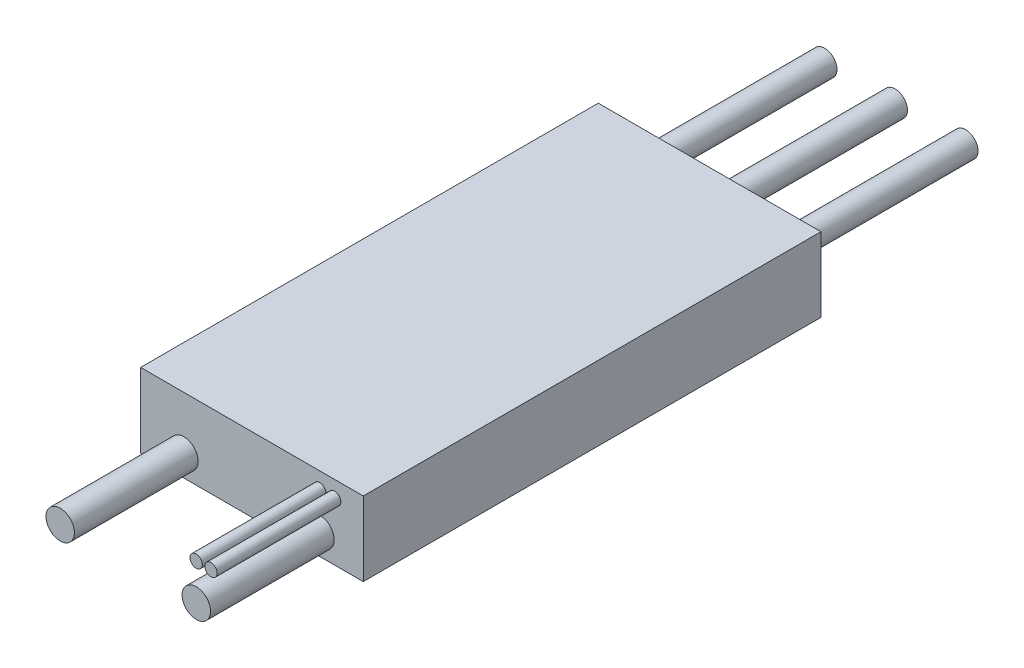
ISO-10303-21;
HEADER;
FILE_DESCRIPTION(('STEP AP214'),'2;1');
FILE_NAME('part.step','',(''),(''),'','','');
FILE_SCHEMA(('AUTOMOTIVE_DESIGN { 1 0 10303 214 1 1 1 1 }'));
ENDSEC;
DATA;
#1=APPLICATION_CONTEXT('core data for automotive mechanical design processes');
#2=APPLICATION_PROTOCOL_DEFINITION('international standard','automotive_design',2000,#1);
#3=PRODUCT_CONTEXT('',#1,'mechanical');
#4=PRODUCT('Part','Part','',(#3));
#5=PRODUCT_RELATED_PRODUCT_CATEGORY('part','',(#4));
#6=PRODUCT_DEFINITION_FORMATION('','',#4);
#7=PRODUCT_DEFINITION_CONTEXT('part definition',#1,'design');
#8=PRODUCT_DEFINITION('design','',#6,#7);
#9=PRODUCT_DEFINITION_SHAPE('','',#8);
#10=(LENGTH_UNIT() NAMED_UNIT(*) SI_UNIT(.MILLI.,.METRE.));
#11=(NAMED_UNIT(*) PLANE_ANGLE_UNIT() SI_UNIT($,.RADIAN.));
#12=(NAMED_UNIT(*) SI_UNIT($,.STERADIAN.) SOLID_ANGLE_UNIT());
#13=UNCERTAINTY_MEASURE_WITH_UNIT(LENGTH_MEASURE(1.E-05),#10,'distance_accuracy_value','');
#14=(GEOMETRIC_REPRESENTATION_CONTEXT(3) GLOBAL_UNCERTAINTY_ASSIGNED_CONTEXT((#13)) GLOBAL_UNIT_ASSIGNED_CONTEXT((#10,
#11,#12)) REPRESENTATION_CONTEXT('',''));
#15=CARTESIAN_POINT('',(0.,0.,0.));
#16=DIRECTION('',(0.,0.,1.));
#17=DIRECTION('',(1.,0.,0.));
#18=AXIS2_PLACEMENT_3D('',#15,#16,#17);
#19=CARTESIAN_POINT('',(-5.7,3.,-33.5));
#20=DIRECTION('',(0.,0.,1.));
#21=DIRECTION('',(1.,0.,0.));
#22=AXIS2_PLACEMENT_3D('',#19,#20,#21);
#23=CYLINDRICAL_SURFACE('',#22,1.);
#24=CARTESIAN_POINT('',(-5.7,3.,-33.5));
#25=DIRECTION('',(0.,0.,-1.));
#26=DIRECTION('',(1.,0.,0.));
#27=AXIS2_PLACEMENT_3D('',#24,#25,#26);
#28=CIRCLE('',#27,1.);
#29=CARTESIAN_POINT('',(-4.7,3.,-33.5));
#30=VERTEX_POINT('',#29);
#31=EDGE_CURVE('E11',#30,#30,#28,.T.);
#32=ORIENTED_EDGE('',*,*,#31,.F.);
#33=EDGE_LOOP('',(#32));
#34=FACE_BOUND('',#33,.T.);
#35=CARTESIAN_POINT('',(-5.7,3.,-18.5));
#36=DIRECTION('',(0.,0.,-1.));
#37=DIRECTION('',(1.,0.,0.));
#38=AXIS2_PLACEMENT_3D('',#35,#36,#37);
#39=CIRCLE('',#38,1.);
#40=CARTESIAN_POINT('',(-4.7,3.,-18.5));
#41=VERTEX_POINT('',#40);
#42=EDGE_CURVE('E47',#41,#41,#39,.T.);
#43=ORIENTED_EDGE('',*,*,#42,.T.);
#44=EDGE_LOOP('',(#43));
#45=FACE_BOUND('',#44,.T.);
#46=ADVANCED_FACE('F44',(#34,#45),#23,.T.);
#47=CARTESIAN_POINT('',(-5.7,3.,-33.5));
#48=DIRECTION('',(0.,0.,1.));
#49=DIRECTION('',(1.,0.,0.));
#50=AXIS2_PLACEMENT_3D('',#47,#48,#49);
#51=PLANE('',#50);
#52=ORIENTED_EDGE('',*,*,#31,.T.);
#53=EDGE_LOOP('',(#52));
#54=FACE_BOUND('',#53,.T.);
#55=ADVANCED_FACE('F59',(#54),#51,.F.);
#56=CARTESIAN_POINT('',(-5.7,3.,-18.5));
#57=DIRECTION('',(0.,0.,1.));
#58=DIRECTION('',(1.,0.,0.));
#59=AXIS2_PLACEMENT_3D('',#56,#57,#58);
#60=PLANE('',#59);
#61=ORIENTED_EDGE('',*,*,#42,.F.);
#62=EDGE_LOOP('',(#61));
#63=FACE_BOUND('',#62,.T.);
#64=ADVANCED_FACE('F57',(#63),#60,.T.);
#65=CLOSED_SHELL('',(#46,#55,#64));
#66=MANIFOLD_SOLID_BREP('B2',#65);
#67=CARTESIAN_POINT('',(0.,3.,-33.5));
#68=DIRECTION('',(0.,0.,1.));
#69=DIRECTION('',(1.,0.,0.));
#70=AXIS2_PLACEMENT_3D('',#67,#68,#69);
#71=CYLINDRICAL_SURFACE('',#70,1.);
#72=CARTESIAN_POINT('',(0.,3.,-33.5));
#73=DIRECTION('',(0.,0.,-1.));
#74=DIRECTION('',(-1.,0.,0.));
#75=AXIS2_PLACEMENT_3D('',#72,#73,#74);
#76=CIRCLE('',#75,1.);
#77=CARTESIAN_POINT('',(-1.,3.,-33.5));
#78=VERTEX_POINT('',#77);
#79=EDGE_CURVE('E43',#78,#78,#76,.T.);
#80=ORIENTED_EDGE('',*,*,#79,.F.);
#81=EDGE_LOOP('',(#80));
#82=FACE_BOUND('',#81,.T.);
#83=CARTESIAN_POINT('',(0.,3.,-18.5));
#84=DIRECTION('',(0.,0.,-1.));
#85=DIRECTION('',(-1.,0.,0.));
#86=AXIS2_PLACEMENT_3D('',#83,#84,#85);
#87=CIRCLE('',#86,1.);
#88=CARTESIAN_POINT('',(-1.,3.,-18.5));
#89=VERTEX_POINT('',#88);
#90=EDGE_CURVE('E100',#89,#89,#87,.T.);
#91=ORIENTED_EDGE('',*,*,#90,.T.);
#92=EDGE_LOOP('',(#91));
#93=FACE_BOUND('',#92,.T.);
#94=ADVANCED_FACE('F97',(#82,#93),#71,.T.);
#95=CARTESIAN_POINT('',(0.,3.,-33.5));
#96=DIRECTION('',(0.,0.,-1.));
#97=DIRECTION('',(-1.,0.,0.));
#98=AXIS2_PLACEMENT_3D('',#95,#96,#97);
#99=PLANE('',#98);
#100=ORIENTED_EDGE('',*,*,#79,.T.);
#101=EDGE_LOOP('',(#100));
#102=FACE_BOUND('',#101,.T.);
#103=ADVANCED_FACE('F112',(#102),#99,.T.);
#104=CARTESIAN_POINT('',(0.,3.,-18.5));
#105=DIRECTION('',(0.,0.,-1.));
#106=DIRECTION('',(-1.,0.,0.));
#107=AXIS2_PLACEMENT_3D('',#104,#105,#106);
#108=PLANE('',#107);
#109=ORIENTED_EDGE('',*,*,#90,.F.);
#110=EDGE_LOOP('',(#109));
#111=FACE_BOUND('',#110,.T.);
#112=ADVANCED_FACE('F110',(#111),#108,.F.);
#113=CLOSED_SHELL('',(#94,#103,#112));
#114=MANIFOLD_SOLID_BREP('B6',#113);
#115=CARTESIAN_POINT('',(5.7,3.,-33.5));
#116=DIRECTION('',(0.,0.,1.));
#117=DIRECTION('',(1.,0.,0.));
#118=AXIS2_PLACEMENT_3D('',#115,#116,#117);
#119=CYLINDRICAL_SURFACE('',#118,1.);
#120=CARTESIAN_POINT('',(5.7,3.,-33.5));
#121=DIRECTION('',(0.,0.,-1.));
#122=DIRECTION('',(-1.,0.,0.));
#123=AXIS2_PLACEMENT_3D('',#120,#121,#122);
#124=CIRCLE('',#123,1.);
#125=CARTESIAN_POINT('',(4.7,3.,-33.5));
#126=VERTEX_POINT('',#125);
#127=EDGE_CURVE('E96',#126,#126,#124,.T.);
#128=ORIENTED_EDGE('',*,*,#127,.F.);
#129=EDGE_LOOP('',(#128));
#130=FACE_BOUND('',#129,.T.);
#131=CARTESIAN_POINT('',(5.7,3.,-18.5));
#132=DIRECTION('',(0.,0.,-1.));
#133=DIRECTION('',(-1.,0.,0.));
#134=AXIS2_PLACEMENT_3D('',#131,#132,#133);
#135=CIRCLE('',#134,1.);
#136=CARTESIAN_POINT('',(4.7,3.,-18.5));
#137=VERTEX_POINT('',#136);
#138=EDGE_CURVE('E153',#137,#137,#135,.T.);
#139=ORIENTED_EDGE('',*,*,#138,.T.);
#140=EDGE_LOOP('',(#139));
#141=FACE_BOUND('',#140,.T.);
#142=ADVANCED_FACE('F150',(#130,#141),#119,.T.);
#143=CARTESIAN_POINT('',(5.7,3.,-33.5));
#144=DIRECTION('',(0.,0.,-1.));
#145=DIRECTION('',(-1.,0.,0.));
#146=AXIS2_PLACEMENT_3D('',#143,#144,#145);
#147=PLANE('',#146);
#148=ORIENTED_EDGE('',*,*,#127,.T.);
#149=EDGE_LOOP('',(#148));
#150=FACE_BOUND('',#149,.T.);
#151=ADVANCED_FACE('F165',(#150),#147,.T.);
#152=CARTESIAN_POINT('',(5.7,3.,-18.5));
#153=DIRECTION('',(0.,0.,-1.));
#154=DIRECTION('',(-1.,0.,0.));
#155=AXIS2_PLACEMENT_3D('',#152,#153,#154);
#156=PLANE('',#155);
#157=ORIENTED_EDGE('',*,*,#138,.F.);
#158=EDGE_LOOP('',(#157));
#159=FACE_BOUND('',#158,.T.);
#160=ADVANCED_FACE('F163',(#159),#156,.F.);
#161=CLOSED_SHELL('',(#142,#151,#160));
#162=MANIFOLD_SOLID_BREP('B38',#161);
#163=CARTESIAN_POINT('',(5.48803139487624,4.68121296625948,28.5));
#164=DIRECTION('',(0.,0.,-1.));
#165=DIRECTION('',(-1.,0.,0.));
#166=AXIS2_PLACEMENT_3D('',#163,#164,#165);
#167=CYLINDRICAL_SURFACE('',#166,0.500000000000001);
#168=CARTESIAN_POINT('',(5.48803139487624,4.68121296625948,28.5));
#169=DIRECTION('',(0.,0.,1.));
#170=DIRECTION('',(1.,0.,0.));
#171=AXIS2_PLACEMENT_3D('',#168,#169,#170);
#172=CIRCLE('',#171,0.500000000000001);
#173=CARTESIAN_POINT('',(5.98803139487624,4.68121296625948,28.5));
#174=VERTEX_POINT('',#173);
#175=EDGE_CURVE('E149',#174,#174,#172,.T.);
#176=ORIENTED_EDGE('',*,*,#175,.F.);
#177=EDGE_LOOP('',(#176));
#178=FACE_BOUND('',#177,.T.);
#179=CARTESIAN_POINT('',(5.48803139487624,4.68121296625948,18.5));
#180=DIRECTION('',(0.,0.,1.));
#181=DIRECTION('',(1.,0.,0.));
#182=AXIS2_PLACEMENT_3D('',#179,#180,#181);
#183=CIRCLE('',#182,0.500000000000001);
#184=CARTESIAN_POINT('',(5.98803139487624,4.68121296625948,18.5));
#185=VERTEX_POINT('',#184);
#186=EDGE_CURVE('E206',#185,#185,#183,.T.);
#187=ORIENTED_EDGE('',*,*,#186,.T.);
#188=EDGE_LOOP('',(#187));
#189=FACE_BOUND('',#188,.T.);
#190=ADVANCED_FACE('F203',(#178,#189),#167,.T.);
#191=CARTESIAN_POINT('',(5.48803139487624,4.68121296625948,28.5));
#192=DIRECTION('',(0.,0.,1.));
#193=DIRECTION('',(1.,0.,0.));
#194=AXIS2_PLACEMENT_3D('',#191,#192,#193);
#195=PLANE('',#194);
#196=ORIENTED_EDGE('',*,*,#175,.T.);
#197=EDGE_LOOP('',(#196));
#198=FACE_BOUND('',#197,.T.);
#199=ADVANCED_FACE('F218',(#198),#195,.T.);
#200=CARTESIAN_POINT('',(5.48803139487624,4.68121296625948,18.5));
#201=DIRECTION('',(0.,0.,1.));
#202=DIRECTION('',(1.,0.,0.));
#203=AXIS2_PLACEMENT_3D('',#200,#201,#202);
#204=PLANE('',#203);
#205=ORIENTED_EDGE('',*,*,#186,.F.);
#206=EDGE_LOOP('',(#205));
#207=FACE_BOUND('',#206,.T.);
#208=ADVANCED_FACE('F216',(#207),#204,.F.);
#209=CLOSED_SHELL('',(#190,#199,#208));
#210=MANIFOLD_SOLID_BREP('B91',#209);
#211=CARTESIAN_POINT('',(6.68803139487624,4.68121296625948,28.5));
#212=DIRECTION('',(0.,0.,-1.));
#213=DIRECTION('',(-1.,0.,0.));
#214=AXIS2_PLACEMENT_3D('',#211,#212,#213);
#215=CYLINDRICAL_SURFACE('',#214,0.500000000000001);
#216=CARTESIAN_POINT('',(6.68803139487624,4.68121296625948,28.5));
#217=DIRECTION('',(0.,0.,1.));
#218=DIRECTION('',(1.,0.,0.));
#219=AXIS2_PLACEMENT_3D('',#216,#217,#218);
#220=CIRCLE('',#219,0.500000000000001);
#221=CARTESIAN_POINT('',(7.18803139487624,4.68121296625948,28.5));
#222=VERTEX_POINT('',#221);
#223=EDGE_CURVE('E202',#222,#222,#220,.T.);
#224=ORIENTED_EDGE('',*,*,#223,.F.);
#225=EDGE_LOOP('',(#224));
#226=FACE_BOUND('',#225,.T.);
#227=CARTESIAN_POINT('',(6.68803139487624,4.68121296625948,18.5));
#228=DIRECTION('',(0.,0.,1.));
#229=DIRECTION('',(1.,0.,0.));
#230=AXIS2_PLACEMENT_3D('',#227,#228,#229);
#231=CIRCLE('',#230,0.500000000000001);
#232=CARTESIAN_POINT('',(7.18803139487624,4.68121296625948,18.5));
#233=VERTEX_POINT('',#232);
#234=EDGE_CURVE('E259',#233,#233,#231,.T.);
#235=ORIENTED_EDGE('',*,*,#234,.T.);
#236=EDGE_LOOP('',(#235));
#237=FACE_BOUND('',#236,.T.);
#238=ADVANCED_FACE('F256',(#226,#237),#215,.T.);
#239=CARTESIAN_POINT('',(6.68803139487624,4.68121296625948,28.5));
#240=DIRECTION('',(0.,0.,1.));
#241=DIRECTION('',(1.,0.,0.));
#242=AXIS2_PLACEMENT_3D('',#239,#240,#241);
#243=PLANE('',#242);
#244=ORIENTED_EDGE('',*,*,#223,.T.);
#245=EDGE_LOOP('',(#244));
#246=FACE_BOUND('',#245,.T.);
#247=ADVANCED_FACE('F271',(#246),#243,.T.);
#248=CARTESIAN_POINT('',(6.68803139487624,4.68121296625948,18.5));
#249=DIRECTION('',(0.,0.,1.));
#250=DIRECTION('',(1.,0.,0.));
#251=AXIS2_PLACEMENT_3D('',#248,#249,#250);
#252=PLANE('',#251);
#253=ORIENTED_EDGE('',*,*,#234,.F.);
#254=EDGE_LOOP('',(#253));
#255=FACE_BOUND('',#254,.T.);
#256=ADVANCED_FACE('F269',(#255),#252,.F.);
#257=CLOSED_SHELL('',(#238,#247,#256));
#258=MANIFOLD_SOLID_BREP('B144',#257);
#259=CARTESIAN_POINT('',(5.5,1.74536263187153,28.5));
#260=DIRECTION('',(0.,0.,-1.));
#261=DIRECTION('',(-1.,0.,0.));
#262=AXIS2_PLACEMENT_3D('',#259,#260,#261);
#263=CYLINDRICAL_SURFACE('',#262,1.15);
#264=CARTESIAN_POINT('',(5.5,1.74536263187153,28.5));
#265=DIRECTION('',(0.,0.,1.));
#266=DIRECTION('',(-1.,0.,0.));
#267=AXIS2_PLACEMENT_3D('',#264,#265,#266);
#268=CIRCLE('',#267,1.15);
#269=CARTESIAN_POINT('',(4.35,1.74536263187153,28.5));
#270=VERTEX_POINT('',#269);
#271=EDGE_CURVE('E255',#270,#270,#268,.T.);
#272=ORIENTED_EDGE('',*,*,#271,.F.);
#273=EDGE_LOOP('',(#272));
#274=FACE_BOUND('',#273,.T.);
#275=CARTESIAN_POINT('',(5.5,1.74536263187153,18.5));
#276=DIRECTION('',(0.,0.,1.));
#277=DIRECTION('',(-1.,0.,0.));
#278=AXIS2_PLACEMENT_3D('',#275,#276,#277);
#279=CIRCLE('',#278,1.15);
#280=CARTESIAN_POINT('',(4.35,1.74536263187153,18.5));
#281=VERTEX_POINT('',#280);
#282=EDGE_CURVE('E312',#281,#281,#279,.T.);
#283=ORIENTED_EDGE('',*,*,#282,.T.);
#284=EDGE_LOOP('',(#283));
#285=FACE_BOUND('',#284,.T.);
#286=ADVANCED_FACE('F309',(#274,#285),#263,.T.);
#287=CARTESIAN_POINT('',(5.5,1.74536263187153,28.5));
#288=DIRECTION('',(0.,0.,-1.));
#289=DIRECTION('',(-1.,0.,0.));
#290=AXIS2_PLACEMENT_3D('',#287,#288,#289);
#291=PLANE('',#290);
#292=ORIENTED_EDGE('',*,*,#271,.T.);
#293=EDGE_LOOP('',(#292));
#294=FACE_BOUND('',#293,.T.);
#295=ADVANCED_FACE('F324',(#294),#291,.F.);
#296=CARTESIAN_POINT('',(5.5,1.74536263187153,18.5));
#297=DIRECTION('',(0.,0.,-1.));
#298=DIRECTION('',(-1.,0.,0.));
#299=AXIS2_PLACEMENT_3D('',#296,#297,#298);
#300=PLANE('',#299);
#301=ORIENTED_EDGE('',*,*,#282,.F.);
#302=EDGE_LOOP('',(#301));
#303=FACE_BOUND('',#302,.T.);
#304=ADVANCED_FACE('F322',(#303),#300,.T.);
#305=CLOSED_SHELL('',(#286,#295,#304));
#306=MANIFOLD_SOLID_BREP('B197',#305);
#307=CARTESIAN_POINT('',(-5.5,1.74536263187153,28.5));
#308=DIRECTION('',(0.,0.,-1.));
#309=DIRECTION('',(-1.,0.,0.));
#310=AXIS2_PLACEMENT_3D('',#307,#308,#309);
#311=CYLINDRICAL_SURFACE('',#310,1.15);
#312=CARTESIAN_POINT('',(-5.5,1.74536263187153,28.5));
#313=DIRECTION('',(0.,0.,1.));
#314=DIRECTION('',(1.,0.,0.));
#315=AXIS2_PLACEMENT_3D('',#312,#313,#314);
#316=CIRCLE('',#315,1.15);
#317=CARTESIAN_POINT('',(-4.35,1.74536263187153,28.5));
#318=VERTEX_POINT('',#317);
#319=EDGE_CURVE('E308',#318,#318,#316,.T.);
#320=ORIENTED_EDGE('',*,*,#319,.F.);
#321=EDGE_LOOP('',(#320));
#322=FACE_BOUND('',#321,.T.);
#323=CARTESIAN_POINT('',(-5.5,1.74536263187153,18.5));
#324=DIRECTION('',(0.,0.,1.));
#325=DIRECTION('',(1.,0.,0.));
#326=AXIS2_PLACEMENT_3D('',#323,#324,#325);
#327=CIRCLE('',#326,1.15);
#328=CARTESIAN_POINT('',(-4.35,1.74536263187153,18.5));
#329=VERTEX_POINT('',#328);
#330=EDGE_CURVE('E366',#329,#329,#327,.T.);
#331=ORIENTED_EDGE('',*,*,#330,.T.);
#332=EDGE_LOOP('',(#331));
#333=FACE_BOUND('',#332,.T.);
#334=ADVANCED_FACE('F363',(#322,#333),#311,.T.);
#335=CARTESIAN_POINT('',(-5.5,1.74536263187153,28.5));
#336=DIRECTION('',(0.,0.,1.));
#337=DIRECTION('',(1.,0.,0.));
#338=AXIS2_PLACEMENT_3D('',#335,#336,#337);
#339=PLANE('',#338);
#340=ORIENTED_EDGE('',*,*,#319,.T.);
#341=EDGE_LOOP('',(#340));
#342=FACE_BOUND('',#341,.T.);
#343=ADVANCED_FACE('F378',(#342),#339,.T.);
#344=CARTESIAN_POINT('',(-5.5,1.74536263187153,18.5));
#345=DIRECTION('',(0.,0.,1.));
#346=DIRECTION('',(1.,0.,0.));
#347=AXIS2_PLACEMENT_3D('',#344,#345,#346);
#348=PLANE('',#347);
#349=ORIENTED_EDGE('',*,*,#330,.F.);
#350=EDGE_LOOP('',(#349));
#351=FACE_BOUND('',#350,.T.);
#352=ADVANCED_FACE('F376',(#351),#348,.F.);
#353=CLOSED_SHELL('',(#334,#343,#352));
#354=MANIFOLD_SOLID_BREP('B250',#353);
#355=CARTESIAN_POINT('',(-9.,6.,-18.5));
#356=DIRECTION('',(1.,0.,0.));
#357=DIRECTION('',(0.,0.,-1.));
#358=AXIS2_PLACEMENT_3D('',#355,#356,#357);
#359=PLANE('',#358);
#360=DIRECTION('',(0.,0.,1.));
#361=VECTOR('',#360,1.);
#362=CARTESIAN_POINT('',(-9.,0.,-18.5));
#363=LINE('',#362,#361);
#364=CARTESIAN_POINT('',(-9.,0.,-18.5));
#365=VERTEX_POINT('',#364);
#366=CARTESIAN_POINT('',(-9.,0.,18.5));
#367=VERTEX_POINT('',#366);
#368=EDGE_CURVE('E471',#365,#367,#363,.T.);
#369=ORIENTED_EDGE('',*,*,#368,.T.);
#370=DIRECTION('',(0.,-1.,0.));
#371=VECTOR('',#370,1.);
#372=CARTESIAN_POINT('',(-9.,6.,18.5));
#373=LINE('',#372,#371);
#374=CARTESIAN_POINT('',(-9.,6.,18.5));
#375=VERTEX_POINT('',#374);
#376=EDGE_CURVE('E361',#375,#367,#373,.T.);
#377=ORIENTED_EDGE('',*,*,#376,.F.);
#378=DIRECTION('',(0.,0.,1.));
#379=VECTOR('',#378,1.);
#380=CARTESIAN_POINT('',(-9.,6.,-18.5));
#381=LINE('',#380,#379);
#382=CARTESIAN_POINT('',(-9.,6.,-18.5));
#383=VERTEX_POINT('',#382);
#384=EDGE_CURVE('E459',#383,#375,#381,.T.);
#385=ORIENTED_EDGE('',*,*,#384,.F.);
#386=DIRECTION('',(0.,-1.,0.));
#387=VECTOR('',#386,1.);
#388=CARTESIAN_POINT('',(-9.,6.,-18.5));
#389=LINE('',#388,#387);
#390=EDGE_CURVE('E467',#383,#365,#389,.T.);
#391=ORIENTED_EDGE('',*,*,#390,.T.);
#392=EDGE_LOOP('',(#369,#377,#385,#391));
#393=FACE_BOUND('',#392,.T.);
#394=ADVANCED_FACE('F408',(#393),#359,.F.);
#395=CARTESIAN_POINT('',(-9.,6.,18.5));
#396=DIRECTION('',(0.,0.,-1.));
#397=DIRECTION('',(-1.,0.,0.));
#398=AXIS2_PLACEMENT_3D('',#395,#396,#397);
#399=PLANE('',#398);
#400=DIRECTION('',(1.,0.,0.));
#401=VECTOR('',#400,1.);
#402=CARTESIAN_POINT('',(-9.,0.,18.5));
#403=LINE('',#402,#401);
#404=CARTESIAN_POINT('',(9.,0.,18.5));
#405=VERTEX_POINT('',#404);
#406=EDGE_CURVE('E463',#367,#405,#403,.T.);
#407=ORIENTED_EDGE('',*,*,#406,.T.);
#408=DIRECTION('',(0.,-1.,0.));
#409=VECTOR('',#408,1.);
#410=CARTESIAN_POINT('',(9.,6.,18.5));
#411=LINE('',#410,#409);
#412=CARTESIAN_POINT('',(9.,6.,18.5));
#413=VERTEX_POINT('',#412);
#414=EDGE_CURVE('E416',#413,#405,#411,.T.);
#415=ORIENTED_EDGE('',*,*,#414,.F.);
#416=DIRECTION('',(1.,0.,0.));
#417=VECTOR('',#416,1.);
#418=CARTESIAN_POINT('',(-9.,6.,18.5));
#419=LINE('',#418,#417);
#420=EDGE_CURVE('E454',#375,#413,#419,.T.);
#421=ORIENTED_EDGE('',*,*,#420,.F.);
#422=ORIENTED_EDGE('',*,*,#376,.T.);
#423=EDGE_LOOP('',(#407,#415,#421,#422));
#424=FACE_BOUND('',#423,.T.);
#425=ADVANCED_FACE('F462',(#424),#399,.F.);
#426=CARTESIAN_POINT('',(9.,6.,-18.5));
#427=DIRECTION('',(-1.,0.,0.));
#428=DIRECTION('',(0.,0.,1.));
#429=AXIS2_PLACEMENT_3D('',#426,#427,#428);
#430=PLANE('',#429);
#431=DIRECTION('',(0.,0.,-1.));
#432=VECTOR('',#431,1.);
#433=CARTESIAN_POINT('',(9.,0.,-18.5));
#434=LINE('',#433,#432);
#435=CARTESIAN_POINT('',(9.,0.,-18.5));
#436=VERTEX_POINT('',#435);
#437=EDGE_CURVE('E441',#405,#436,#434,.T.);
#438=ORIENTED_EDGE('',*,*,#437,.T.);
#439=DIRECTION('',(0.,-1.,0.));
#440=VECTOR('',#439,1.);
#441=CARTESIAN_POINT('',(9.,6.,-18.5));
#442=LINE('',#441,#440);
#443=CARTESIAN_POINT('',(9.,6.,-18.5));
#444=VERTEX_POINT('',#443);
#445=EDGE_CURVE('E464',#444,#436,#442,.T.);
#446=ORIENTED_EDGE('',*,*,#445,.F.);
#447=DIRECTION('',(0.,0.,-1.));
#448=VECTOR('',#447,1.);
#449=CARTESIAN_POINT('',(9.,6.,-18.5));
#450=LINE('',#449,#448);
#451=EDGE_CURVE('E457',#413,#444,#450,.T.);
#452=ORIENTED_EDGE('',*,*,#451,.F.);
#453=ORIENTED_EDGE('',*,*,#414,.T.);
#454=EDGE_LOOP('',(#438,#446,#452,#453));
#455=FACE_BOUND('',#454,.T.);
#456=ADVANCED_FACE('F465',(#455),#430,.F.);
#457=CARTESIAN_POINT('',(-9.,6.,-18.5));
#458=DIRECTION('',(0.,0.,1.));
#459=DIRECTION('',(1.,0.,0.));
#460=AXIS2_PLACEMENT_3D('',#457,#458,#459);
#461=PLANE('',#460);
#462=DIRECTION('',(-1.,0.,0.));
#463=VECTOR('',#462,1.);
#464=CARTESIAN_POINT('',(-9.,0.,-18.5));
#465=LINE('',#464,#463);
#466=EDGE_CURVE('E447',#436,#365,#465,.T.);
#467=ORIENTED_EDGE('',*,*,#466,.T.);
#468=ORIENTED_EDGE('',*,*,#390,.F.);
#469=DIRECTION('',(-1.,0.,0.));
#470=VECTOR('',#469,1.);
#471=CARTESIAN_POINT('',(-9.,6.,-18.5));
#472=LINE('',#471,#470);
#473=EDGE_CURVE('E424',#444,#383,#472,.T.);
#474=ORIENTED_EDGE('',*,*,#473,.F.);
#475=ORIENTED_EDGE('',*,*,#445,.T.);
#476=EDGE_LOOP('',(#467,#468,#474,#475));
#477=FACE_BOUND('',#476,.T.);
#478=ADVANCED_FACE('F478',(#477),#461,.F.);
#479=CARTESIAN_POINT('',(0.,6.,0.));
#480=DIRECTION('',(0.,1.,0.));
#481=DIRECTION('',(0.,0.,1.));
#482=AXIS2_PLACEMENT_3D('',#479,#480,#481);
#483=PLANE('',#482);
#484=ORIENTED_EDGE('',*,*,#384,.T.);
#485=ORIENTED_EDGE('',*,*,#420,.T.);
#486=ORIENTED_EDGE('',*,*,#451,.T.);
#487=ORIENTED_EDGE('',*,*,#473,.T.);
#488=EDGE_LOOP('',(#484,#485,#486,#487));
#489=FACE_BOUND('',#488,.T.);
#490=ADVANCED_FACE('F455',(#489),#483,.T.);
#491=CARTESIAN_POINT('',(0.,0.,0.));
#492=DIRECTION('',(0.,1.,0.));
#493=DIRECTION('',(0.,0.,1.));
#494=AXIS2_PLACEMENT_3D('',#491,#492,#493);
#495=PLANE('',#494);
#496=ORIENTED_EDGE('',*,*,#368,.F.);
#497=ORIENTED_EDGE('',*,*,#466,.F.);
#498=ORIENTED_EDGE('',*,*,#437,.F.);
#499=ORIENTED_EDGE('',*,*,#406,.F.);
#500=EDGE_LOOP('',(#496,#497,#498,#499));
#501=FACE_BOUND('',#500,.T.);
#502=ADVANCED_FACE('F481',(#501),#495,.F.);
#503=CLOSED_SHELL('',(#394,#425,#456,#478,#490,#502));
#504=MANIFOLD_SOLID_BREP('B303',#503);
#505=ADVANCED_BREP_SHAPE_REPRESENTATION('',(#18,#66,#114,#162,#210,#258,#306,#354,#504),#14);
#506=SHAPE_DEFINITION_REPRESENTATION(#9,#505);
ENDSEC;
END-ISO-10303-21;
